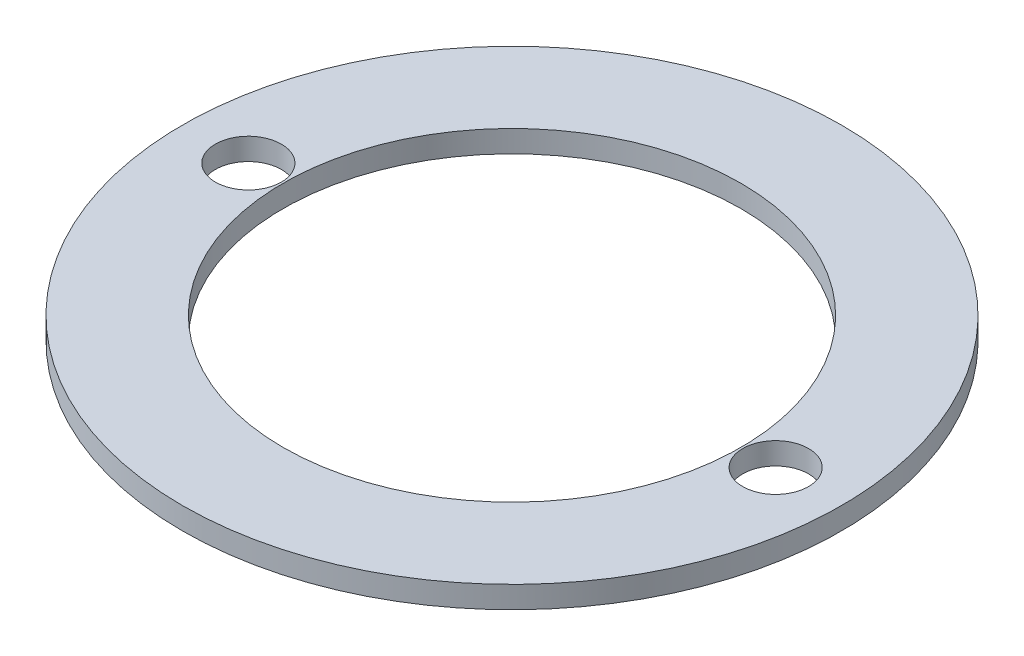
ISO-10303-21;
HEADER;
FILE_DESCRIPTION(('STEP AP214'),'2;1');
FILE_NAME('part.step','',(''),(''),'','','');
FILE_SCHEMA(('AUTOMOTIVE_DESIGN { 1 0 10303 214 1 1 1 1 }'));
ENDSEC;
DATA;
#1=APPLICATION_CONTEXT('core data for automotive mechanical design processes');
#2=APPLICATION_PROTOCOL_DEFINITION('international standard','automotive_design',2000,#1);
#3=PRODUCT_CONTEXT('',#1,'mechanical');
#4=PRODUCT('Part','Part','',(#3));
#5=PRODUCT_RELATED_PRODUCT_CATEGORY('part','',(#4));
#6=PRODUCT_DEFINITION_FORMATION('','',#4);
#7=PRODUCT_DEFINITION_CONTEXT('part definition',#1,'design');
#8=PRODUCT_DEFINITION('design','',#6,#7);
#9=PRODUCT_DEFINITION_SHAPE('','',#8);
#10=(LENGTH_UNIT() NAMED_UNIT(*) SI_UNIT(.MILLI.,.METRE.));
#11=(NAMED_UNIT(*) PLANE_ANGLE_UNIT() SI_UNIT($,.RADIAN.));
#12=(NAMED_UNIT(*) SI_UNIT($,.STERADIAN.) SOLID_ANGLE_UNIT());
#13=UNCERTAINTY_MEASURE_WITH_UNIT(LENGTH_MEASURE(1.E-05),#10,'distance_accuracy_value','');
#14=(GEOMETRIC_REPRESENTATION_CONTEXT(3) GLOBAL_UNCERTAINTY_ASSIGNED_CONTEXT((#13)) GLOBAL_UNIT_ASSIGNED_CONTEXT((#10,
#11,#12)) REPRESENTATION_CONTEXT('',''));
#15=CARTESIAN_POINT('',(0.,0.,0.));
#16=DIRECTION('',(0.,0.,1.));
#17=DIRECTION('',(1.,0.,0.));
#18=AXIS2_PLACEMENT_3D('',#15,#16,#17);
#19=CARTESIAN_POINT('',(0.,1.524,0.));
#20=DIRECTION('',(0.,1.,0.));
#21=DIRECTION('',(0.,0.,1.));
#22=AXIS2_PLACEMENT_3D('',#19,#20,#21);
#23=PLANE('',#22);
#24=CARTESIAN_POINT('',(-18.288,1.524,0.));
#25=DIRECTION('',(0.,1.,0.));
#26=DIRECTION('',(0.,0.,1.));
#27=AXIS2_PLACEMENT_3D('',#24,#25,#26);
#28=CIRCLE('',#27,2.286);
#29=CARTESIAN_POINT('',(-18.288,1.524,-2.286));
#30=VERTEX_POINT('',#29);
#31=EDGE_CURVE('E51',#30,#30,#28,.T.);
#32=ORIENTED_EDGE('',*,*,#31,.F.);
#33=EDGE_LOOP('',(#32));
#34=FACE_BOUND('',#33,.T.);
#35=CARTESIAN_POINT('',(0.,1.524,0.));
#36=DIRECTION('',(0.,1.,0.));
#37=DIRECTION('',(0.,0.,1.));
#38=AXIS2_PLACEMENT_3D('',#35,#36,#37);
#39=CIRCLE('',#38,22.86);
#40=CARTESIAN_POINT('',(0.,1.524,-22.86));
#41=VERTEX_POINT('',#40);
#42=EDGE_CURVE('E10',#41,#41,#39,.T.);
#43=ORIENTED_EDGE('',*,*,#42,.T.);
#44=EDGE_LOOP('',(#43));
#45=FACE_BOUND('',#44,.T.);
#46=CARTESIAN_POINT('',(0.,1.524,0.));
#47=DIRECTION('',(0.,1.,0.));
#48=DIRECTION('',(0.,0.,1.));
#49=AXIS2_PLACEMENT_3D('',#46,#47,#48);
#50=CIRCLE('',#49,15.875);
#51=CARTESIAN_POINT('',(0.,1.524,-15.875));
#52=VERTEX_POINT('',#51);
#53=EDGE_CURVE('E46',#52,#52,#50,.T.);
#54=ORIENTED_EDGE('',*,*,#53,.F.);
#55=EDGE_LOOP('',(#54));
#56=FACE_BOUND('',#55,.T.);
#57=CARTESIAN_POINT('',(18.288,1.524,0.));
#58=DIRECTION('',(0.,1.,0.));
#59=DIRECTION('',(0.,0.,1.));
#60=AXIS2_PLACEMENT_3D('',#57,#58,#59);
#61=CIRCLE('',#60,2.286);
#62=CARTESIAN_POINT('',(18.288,1.524,-2.286));
#63=VERTEX_POINT('',#62);
#64=EDGE_CURVE('E57',#63,#63,#61,.T.);
#65=ORIENTED_EDGE('',*,*,#64,.F.);
#66=EDGE_LOOP('',(#65));
#67=FACE_BOUND('',#66,.T.);
#68=ADVANCED_FACE('F35',(#34,#45,#56,#67),#23,.T.);
#69=CARTESIAN_POINT('',(0.,0.,0.));
#70=DIRECTION('',(0.,1.,0.));
#71=DIRECTION('',(0.,0.,1.));
#72=AXIS2_PLACEMENT_3D('',#69,#70,#71);
#73=PLANE('',#72);
#74=CARTESIAN_POINT('',(0.,0.,0.));
#75=DIRECTION('',(0.,1.,0.));
#76=DIRECTION('',(0.,0.,1.));
#77=AXIS2_PLACEMENT_3D('',#74,#75,#76);
#78=CIRCLE('',#77,22.86);
#79=CARTESIAN_POINT('',(0.,0.,-22.86));
#80=VERTEX_POINT('',#79);
#81=EDGE_CURVE('E39',#80,#80,#78,.T.);
#82=ORIENTED_EDGE('',*,*,#81,.F.);
#83=EDGE_LOOP('',(#82));
#84=FACE_BOUND('',#83,.T.);
#85=CARTESIAN_POINT('',(0.,0.,0.));
#86=DIRECTION('',(0.,1.,0.));
#87=DIRECTION('',(0.,0.,1.));
#88=AXIS2_PLACEMENT_3D('',#85,#86,#87);
#89=CIRCLE('',#88,15.875);
#90=CARTESIAN_POINT('',(0.,0.,-15.875));
#91=VERTEX_POINT('',#90);
#92=EDGE_CURVE('E48',#91,#91,#89,.T.);
#93=ORIENTED_EDGE('',*,*,#92,.T.);
#94=EDGE_LOOP('',(#93));
#95=FACE_BOUND('',#94,.T.);
#96=CARTESIAN_POINT('',(-18.288,0.,0.));
#97=DIRECTION('',(0.,1.,0.));
#98=DIRECTION('',(0.,0.,1.));
#99=AXIS2_PLACEMENT_3D('',#96,#97,#98);
#100=CIRCLE('',#99,2.286);
#101=CARTESIAN_POINT('',(-18.288,0.,-2.286));
#102=VERTEX_POINT('',#101);
#103=EDGE_CURVE('E54',#102,#102,#100,.T.);
#104=ORIENTED_EDGE('',*,*,#103,.T.);
#105=EDGE_LOOP('',(#104));
#106=FACE_BOUND('',#105,.T.);
#107=CARTESIAN_POINT('',(18.288,0.,0.));
#108=DIRECTION('',(0.,1.,0.));
#109=DIRECTION('',(0.,0.,1.));
#110=AXIS2_PLACEMENT_3D('',#107,#108,#109);
#111=CIRCLE('',#110,2.286);
#112=CARTESIAN_POINT('',(18.288,0.,-2.286));
#113=VERTEX_POINT('',#112);
#114=EDGE_CURVE('E60',#113,#113,#111,.T.);
#115=ORIENTED_EDGE('',*,*,#114,.T.);
#116=EDGE_LOOP('',(#115));
#117=FACE_BOUND('',#116,.T.);
#118=ADVANCED_FACE('F70',(#84,#95,#106,#117),#73,.F.);
#119=CARTESIAN_POINT('',(0.,1.524,0.));
#120=DIRECTION('',(0.,-1.,0.));
#121=DIRECTION('',(0.,0.,-1.));
#122=AXIS2_PLACEMENT_3D('',#119,#120,#121);
#123=CYLINDRICAL_SURFACE('',#122,22.86);
#124=CARTESIAN_POINT('',(0.,1.524,-22.86));
#125=CARTESIAN_POINT('',(0.,1.508125,-22.86));
#126=CARTESIAN_POINT('',(0.,1.49225,-22.86));
#127=CARTESIAN_POINT('',(0.,1.4605,-22.86));
#128=CARTESIAN_POINT('',(0.,1.444625,-22.86));
#129=CARTESIAN_POINT('',(0.,1.412875,-22.86));
#130=CARTESIAN_POINT('',(0.,1.397,-22.86));
#131=CARTESIAN_POINT('',(0.,1.36525,-22.86));
#132=CARTESIAN_POINT('',(0.,1.349375,-22.86));
#133=CARTESIAN_POINT('',(0.,1.317625,-22.86));
#134=CARTESIAN_POINT('',(0.,1.30175,-22.86));
#135=CARTESIAN_POINT('',(0.,1.27,-22.86));
#136=CARTESIAN_POINT('',(0.,1.254125,-22.86));
#137=CARTESIAN_POINT('',(0.,1.222375,-22.86));
#138=CARTESIAN_POINT('',(0.,1.2065,-22.86));
#139=CARTESIAN_POINT('',(0.,1.17475,-22.86));
#140=CARTESIAN_POINT('',(0.,1.158875,-22.86));
#141=CARTESIAN_POINT('',(0.,1.127125,-22.86));
#142=CARTESIAN_POINT('',(0.,1.11125,-22.86));
#143=CARTESIAN_POINT('',(0.,1.0795,-22.86));
#144=CARTESIAN_POINT('',(0.,1.063625,-22.86));
#145=CARTESIAN_POINT('',(0.,1.031875,-22.86));
#146=CARTESIAN_POINT('',(0.,1.016,-22.86));
#147=CARTESIAN_POINT('',(0.,0.98425,-22.86));
#148=CARTESIAN_POINT('',(0.,0.968375,-22.86));
#149=CARTESIAN_POINT('',(0.,0.936625,-22.86));
#150=CARTESIAN_POINT('',(0.,0.92075,-22.86));
#151=CARTESIAN_POINT('',(0.,0.889,-22.86));
#152=CARTESIAN_POINT('',(0.,0.873125,-22.86));
#153=CARTESIAN_POINT('',(0.,0.841375,-22.86));
#154=CARTESIAN_POINT('',(0.,0.8255,-22.86));
#155=CARTESIAN_POINT('',(0.,0.79375,-22.86));
#156=CARTESIAN_POINT('',(0.,0.777875,-22.86));
#157=CARTESIAN_POINT('',(0.,0.746125,-22.86));
#158=CARTESIAN_POINT('',(0.,0.73025,-22.86));
#159=CARTESIAN_POINT('',(0.,0.6985,-22.86));
#160=CARTESIAN_POINT('',(0.,0.682625,-22.86));
#161=CARTESIAN_POINT('',(0.,0.650875,-22.86));
#162=CARTESIAN_POINT('',(0.,0.635,-22.86));
#163=CARTESIAN_POINT('',(0.,0.60325,-22.86));
#164=CARTESIAN_POINT('',(0.,0.587375,-22.86));
#165=CARTESIAN_POINT('',(0.,0.555625,-22.86));
#166=CARTESIAN_POINT('',(0.,0.53975,-22.86));
#167=CARTESIAN_POINT('',(0.,0.508,-22.86));
#168=CARTESIAN_POINT('',(0.,0.492125,-22.86));
#169=CARTESIAN_POINT('',(0.,0.460375,-22.86));
#170=CARTESIAN_POINT('',(0.,0.4445,-22.86));
#171=CARTESIAN_POINT('',(0.,0.41275,-22.86));
#172=CARTESIAN_POINT('',(0.,0.396875,-22.86));
#173=CARTESIAN_POINT('',(0.,0.365125,-22.86));
#174=CARTESIAN_POINT('',(0.,0.34925,-22.86));
#175=CARTESIAN_POINT('',(0.,0.3175,-22.86));
#176=CARTESIAN_POINT('',(0.,0.301625,-22.86));
#177=CARTESIAN_POINT('',(0.,0.269875,-22.86));
#178=CARTESIAN_POINT('',(0.,0.254,-22.86));
#179=CARTESIAN_POINT('',(0.,0.22225,-22.86));
#180=CARTESIAN_POINT('',(0.,0.206375,-22.86));
#181=CARTESIAN_POINT('',(0.,0.174625,-22.86));
#182=CARTESIAN_POINT('',(0.,0.15875,-22.86));
#183=CARTESIAN_POINT('',(0.,0.127,-22.86));
#184=CARTESIAN_POINT('',(0.,0.111125,-22.86));
#185=CARTESIAN_POINT('',(0.,0.079375,-22.86));
#186=CARTESIAN_POINT('',(0.,0.0635,-22.86));
#187=CARTESIAN_POINT('',(0.,0.0317499999999999,-22.86));
#188=CARTESIAN_POINT('',(0.,0.015875,-22.86));
#189=CARTESIAN_POINT('',(0.,0.,-22.86));
#190=B_SPLINE_CURVE_WITH_KNOTS('',3,(#124,#125,#126,#127,#128,#129,#130,#131,#132,#133,#134,
#135,#136,#137,#138,#139,#140,#141,#142,#143,#144,#145,#146,#147,#148,#149,#150,#151,#152,#153,
#154,#155,#156,#157,#158,#159,#160,#161,#162,#163,#164,#165,#166,#167,#168,#169,#170,#171,#172,
#173,#174,#175,#176,#177,#178,#179,#180,#181,#182,#183,#184,#185,#186,#187,#188,#189),
.UNSPECIFIED.,.F.,.F.,(4,2,2,2,2,2,2,2,2,2,2,2,2,2,2,2,2,2,2,2,2,2,2,2,2,2,2,2,2,2,2,2,4),(0.,
0.0476250000000001,0.0952500000000001,0.142875,0.1905,0.238125,0.28575,0.333375,0.381,0.428625,
0.47625,0.523875,0.5715,0.619125,0.66675,0.714375,0.762,0.809625,0.85725,0.904875,0.9525,
1.000125,1.04775,1.095375,1.143,1.190625,1.23825,1.285875,1.3335,1.381125,1.42875,1.476375,
1.524),.UNSPECIFIED.);
#191=EDGE_CURVE('BSEAM37',#41,#80,#190,.T.);
#192=ORIENTED_EDGE('',*,*,#42,.F.);
#193=ORIENTED_EDGE('',*,*,#81,.T.);
#194=ORIENTED_EDGE('',*,*,#191,.T.);
#195=ORIENTED_EDGE('',*,*,#191,.F.);
#196=EDGE_LOOP('',(#192,#194,#193,#195));
#197=FACE_BOUND('',#196,.T.);
#198=ADVANCED_FACE('F37',(#197),#123,.T.);
#199=CARTESIAN_POINT('',(0.,1.524,0.));
#200=DIRECTION('',(0.,-1.,0.));
#201=DIRECTION('',(0.,0.,-1.));
#202=AXIS2_PLACEMENT_3D('',#199,#200,#201);
#203=CYLINDRICAL_SURFACE('',#202,15.875);
#204=CARTESIAN_POINT('',(0.,1.524,-15.875));
#205=CARTESIAN_POINT('',(0.,1.508125,-15.875));
#206=CARTESIAN_POINT('',(0.,1.49225,-15.875));
#207=CARTESIAN_POINT('',(0.,1.4605,-15.875));
#208=CARTESIAN_POINT('',(0.,1.444625,-15.875));
#209=CARTESIAN_POINT('',(0.,1.412875,-15.875));
#210=CARTESIAN_POINT('',(0.,1.397,-15.875));
#211=CARTESIAN_POINT('',(0.,1.36525,-15.875));
#212=CARTESIAN_POINT('',(0.,1.349375,-15.875));
#213=CARTESIAN_POINT('',(0.,1.317625,-15.875));
#214=CARTESIAN_POINT('',(0.,1.30175,-15.875));
#215=CARTESIAN_POINT('',(0.,1.27,-15.875));
#216=CARTESIAN_POINT('',(0.,1.254125,-15.875));
#217=CARTESIAN_POINT('',(0.,1.222375,-15.875));
#218=CARTESIAN_POINT('',(0.,1.2065,-15.875));
#219=CARTESIAN_POINT('',(0.,1.17475,-15.875));
#220=CARTESIAN_POINT('',(0.,1.158875,-15.875));
#221=CARTESIAN_POINT('',(0.,1.127125,-15.875));
#222=CARTESIAN_POINT('',(0.,1.11125,-15.875));
#223=CARTESIAN_POINT('',(0.,1.0795,-15.875));
#224=CARTESIAN_POINT('',(0.,1.063625,-15.875));
#225=CARTESIAN_POINT('',(0.,1.031875,-15.875));
#226=CARTESIAN_POINT('',(0.,1.016,-15.875));
#227=CARTESIAN_POINT('',(0.,0.98425,-15.875));
#228=CARTESIAN_POINT('',(0.,0.968375,-15.875));
#229=CARTESIAN_POINT('',(0.,0.936625,-15.875));
#230=CARTESIAN_POINT('',(0.,0.92075,-15.875));
#231=CARTESIAN_POINT('',(0.,0.889,-15.875));
#232=CARTESIAN_POINT('',(0.,0.873125,-15.875));
#233=CARTESIAN_POINT('',(0.,0.841375,-15.875));
#234=CARTESIAN_POINT('',(0.,0.8255,-15.875));
#235=CARTESIAN_POINT('',(0.,0.79375,-15.875));
#236=CARTESIAN_POINT('',(0.,0.777875,-15.875));
#237=CARTESIAN_POINT('',(0.,0.746125,-15.875));
#238=CARTESIAN_POINT('',(0.,0.73025,-15.875));
#239=CARTESIAN_POINT('',(0.,0.6985,-15.875));
#240=CARTESIAN_POINT('',(0.,0.682625,-15.875));
#241=CARTESIAN_POINT('',(0.,0.650875,-15.875));
#242=CARTESIAN_POINT('',(0.,0.635,-15.875));
#243=CARTESIAN_POINT('',(0.,0.60325,-15.875));
#244=CARTESIAN_POINT('',(0.,0.587375,-15.875));
#245=CARTESIAN_POINT('',(0.,0.555625,-15.875));
#246=CARTESIAN_POINT('',(0.,0.53975,-15.875));
#247=CARTESIAN_POINT('',(0.,0.508,-15.875));
#248=CARTESIAN_POINT('',(0.,0.492125,-15.875));
#249=CARTESIAN_POINT('',(0.,0.460375,-15.875));
#250=CARTESIAN_POINT('',(0.,0.4445,-15.875));
#251=CARTESIAN_POINT('',(0.,0.41275,-15.875));
#252=CARTESIAN_POINT('',(0.,0.396875,-15.875));
#253=CARTESIAN_POINT('',(0.,0.365125,-15.875));
#254=CARTESIAN_POINT('',(0.,0.34925,-15.875));
#255=CARTESIAN_POINT('',(0.,0.3175,-15.875));
#256=CARTESIAN_POINT('',(0.,0.301625,-15.875));
#257=CARTESIAN_POINT('',(0.,0.269875,-15.875));
#258=CARTESIAN_POINT('',(0.,0.254,-15.875));
#259=CARTESIAN_POINT('',(0.,0.22225,-15.875));
#260=CARTESIAN_POINT('',(0.,0.206375,-15.875));
#261=CARTESIAN_POINT('',(0.,0.174625,-15.875));
#262=CARTESIAN_POINT('',(0.,0.15875,-15.875));
#263=CARTESIAN_POINT('',(0.,0.127,-15.875));
#264=CARTESIAN_POINT('',(0.,0.111125,-15.875));
#265=CARTESIAN_POINT('',(0.,0.079375,-15.875));
#266=CARTESIAN_POINT('',(0.,0.0635,-15.875));
#267=CARTESIAN_POINT('',(0.,0.0317499999999999,-15.875));
#268=CARTESIAN_POINT('',(0.,0.015875,-15.875));
#269=CARTESIAN_POINT('',(0.,0.,-15.875));
#270=B_SPLINE_CURVE_WITH_KNOTS('',3,(#204,#205,#206,#207,#208,#209,#210,#211,#212,#213,#214,
#215,#216,#217,#218,#219,#220,#221,#222,#223,#224,#225,#226,#227,#228,#229,#230,#231,#232,#233,
#234,#235,#236,#237,#238,#239,#240,#241,#242,#243,#244,#245,#246,#247,#248,#249,#250,#251,#252,
#253,#254,#255,#256,#257,#258,#259,#260,#261,#262,#263,#264,#265,#266,#267,#268,#269),
.UNSPECIFIED.,.F.,.F.,(4,2,2,2,2,2,2,2,2,2,2,2,2,2,2,2,2,2,2,2,2,2,2,2,2,2,2,2,2,2,2,2,4),(0.,
0.0476249999999999,0.0952499999999998,0.142875,0.1905,0.238125,0.28575,0.333375,0.381,0.428625,
0.47625,0.523875,0.5715,0.619125,0.66675,0.714375,0.762,0.809625,0.85725,0.904875,0.9525,
1.000125,1.04775,1.095375,1.143,1.190625,1.23825,1.285875,1.3335,1.381125,1.42875,1.476375,
1.524),.UNSPECIFIED.);
#271=EDGE_CURVE('BSEAM79',#52,#91,#270,.T.);
#272=ORIENTED_EDGE('',*,*,#53,.T.);
#273=ORIENTED_EDGE('',*,*,#92,.F.);
#274=ORIENTED_EDGE('',*,*,#271,.T.);
#275=ORIENTED_EDGE('',*,*,#271,.F.);
#276=EDGE_LOOP('',(#272,#274,#273,#275));
#277=FACE_BOUND('',#276,.T.);
#278=ADVANCED_FACE('F79',(#277),#203,.F.);
#279=CARTESIAN_POINT('',(-18.288,1.524,0.));
#280=DIRECTION('',(0.,-1.,0.));
#281=DIRECTION('',(0.,0.,-1.));
#282=AXIS2_PLACEMENT_3D('',#279,#280,#281);
#283=CYLINDRICAL_SURFACE('',#282,2.286);
#284=CARTESIAN_POINT('',(-18.288,1.524,-2.286));
#285=CARTESIAN_POINT('',(-18.288,1.508125,-2.286));
#286=CARTESIAN_POINT('',(-18.288,1.49225,-2.286));
#287=CARTESIAN_POINT('',(-18.288,1.4605,-2.286));
#288=CARTESIAN_POINT('',(-18.288,1.444625,-2.286));
#289=CARTESIAN_POINT('',(-18.288,1.412875,-2.286));
#290=CARTESIAN_POINT('',(-18.288,1.397,-2.286));
#291=CARTESIAN_POINT('',(-18.288,1.36525,-2.286));
#292=CARTESIAN_POINT('',(-18.288,1.349375,-2.286));
#293=CARTESIAN_POINT('',(-18.288,1.317625,-2.286));
#294=CARTESIAN_POINT('',(-18.288,1.30175,-2.286));
#295=CARTESIAN_POINT('',(-18.288,1.27,-2.286));
#296=CARTESIAN_POINT('',(-18.288,1.254125,-2.286));
#297=CARTESIAN_POINT('',(-18.288,1.222375,-2.286));
#298=CARTESIAN_POINT('',(-18.288,1.2065,-2.286));
#299=CARTESIAN_POINT('',(-18.288,1.17475,-2.286));
#300=CARTESIAN_POINT('',(-18.288,1.158875,-2.286));
#301=CARTESIAN_POINT('',(-18.288,1.127125,-2.286));
#302=CARTESIAN_POINT('',(-18.288,1.11125,-2.286));
#303=CARTESIAN_POINT('',(-18.288,1.0795,-2.286));
#304=CARTESIAN_POINT('',(-18.288,1.063625,-2.286));
#305=CARTESIAN_POINT('',(-18.288,1.031875,-2.286));
#306=CARTESIAN_POINT('',(-18.288,1.016,-2.286));
#307=CARTESIAN_POINT('',(-18.288,0.98425,-2.286));
#308=CARTESIAN_POINT('',(-18.288,0.968375,-2.286));
#309=CARTESIAN_POINT('',(-18.288,0.936625,-2.286));
#310=CARTESIAN_POINT('',(-18.288,0.92075,-2.286));
#311=CARTESIAN_POINT('',(-18.288,0.889,-2.286));
#312=CARTESIAN_POINT('',(-18.288,0.873125,-2.286));
#313=CARTESIAN_POINT('',(-18.288,0.841375,-2.286));
#314=CARTESIAN_POINT('',(-18.288,0.8255,-2.286));
#315=CARTESIAN_POINT('',(-18.288,0.79375,-2.286));
#316=CARTESIAN_POINT('',(-18.288,0.777875,-2.286));
#317=CARTESIAN_POINT('',(-18.288,0.746125,-2.286));
#318=CARTESIAN_POINT('',(-18.288,0.73025,-2.286));
#319=CARTESIAN_POINT('',(-18.288,0.6985,-2.286));
#320=CARTESIAN_POINT('',(-18.288,0.682625,-2.286));
#321=CARTESIAN_POINT('',(-18.288,0.650875,-2.286));
#322=CARTESIAN_POINT('',(-18.288,0.635,-2.286));
#323=CARTESIAN_POINT('',(-18.288,0.60325,-2.286));
#324=CARTESIAN_POINT('',(-18.288,0.587375,-2.286));
#325=CARTESIAN_POINT('',(-18.288,0.555625,-2.286));
#326=CARTESIAN_POINT('',(-18.288,0.53975,-2.286));
#327=CARTESIAN_POINT('',(-18.288,0.508,-2.286));
#328=CARTESIAN_POINT('',(-18.288,0.492125,-2.286));
#329=CARTESIAN_POINT('',(-18.288,0.460375,-2.286));
#330=CARTESIAN_POINT('',(-18.288,0.4445,-2.286));
#331=CARTESIAN_POINT('',(-18.288,0.41275,-2.286));
#332=CARTESIAN_POINT('',(-18.288,0.396875,-2.286));
#333=CARTESIAN_POINT('',(-18.288,0.365125,-2.286));
#334=CARTESIAN_POINT('',(-18.288,0.34925,-2.286));
#335=CARTESIAN_POINT('',(-18.288,0.3175,-2.286));
#336=CARTESIAN_POINT('',(-18.288,0.301625,-2.286));
#337=CARTESIAN_POINT('',(-18.288,0.269875,-2.286));
#338=CARTESIAN_POINT('',(-18.288,0.254,-2.286));
#339=CARTESIAN_POINT('',(-18.288,0.22225,-2.286));
#340=CARTESIAN_POINT('',(-18.288,0.206375,-2.286));
#341=CARTESIAN_POINT('',(-18.288,0.174625,-2.286));
#342=CARTESIAN_POINT('',(-18.288,0.15875,-2.286));
#343=CARTESIAN_POINT('',(-18.288,0.127,-2.286));
#344=CARTESIAN_POINT('',(-18.288,0.111125,-2.286));
#345=CARTESIAN_POINT('',(-18.288,0.079375,-2.286));
#346=CARTESIAN_POINT('',(-18.288,0.0635,-2.286));
#347=CARTESIAN_POINT('',(-18.288,0.0317499999999999,-2.286));
#348=CARTESIAN_POINT('',(-18.288,0.015875,-2.286));
#349=CARTESIAN_POINT('',(-18.288,0.,-2.286));
#350=B_SPLINE_CURVE_WITH_KNOTS('',3,(#284,#285,#286,#287,#288,#289,#290,#291,#292,#293,#294,
#295,#296,#297,#298,#299,#300,#301,#302,#303,#304,#305,#306,#307,#308,#309,#310,#311,#312,#313,
#314,#315,#316,#317,#318,#319,#320,#321,#322,#323,#324,#325,#326,#327,#328,#329,#330,#331,#332,
#333,#334,#335,#336,#337,#338,#339,#340,#341,#342,#343,#344,#345,#346,#347,#348,#349),
.UNSPECIFIED.,.F.,.F.,(4,2,2,2,2,2,2,2,2,2,2,2,2,2,2,2,2,2,2,2,2,2,2,2,2,2,2,2,2,2,2,2,4),(0.,
0.0476249999999999,0.0952499999999998,0.142875,0.1905,0.238125,0.28575,0.333375,0.381,0.428625,
0.47625,0.523875,0.5715,0.619125,0.66675,0.714375,0.762,0.809625,0.85725,0.904875,0.9525,
1.000125,1.04775,1.095375,1.143,1.190625,1.23825,1.285875,1.3335,1.381125,1.42875,1.476375,
1.524),.UNSPECIFIED.);
#351=EDGE_CURVE('BSEAM82',#30,#102,#350,.T.);
#352=ORIENTED_EDGE('',*,*,#31,.T.);
#353=ORIENTED_EDGE('',*,*,#103,.F.);
#354=ORIENTED_EDGE('',*,*,#351,.T.);
#355=ORIENTED_EDGE('',*,*,#351,.F.);
#356=EDGE_LOOP('',(#352,#354,#353,#355));
#357=FACE_BOUND('',#356,.T.);
#358=ADVANCED_FACE('F82',(#357),#283,.F.);
#359=CARTESIAN_POINT('',(18.288,1.524,0.));
#360=DIRECTION('',(0.,-1.,0.));
#361=DIRECTION('',(0.,0.,-1.));
#362=AXIS2_PLACEMENT_3D('',#359,#360,#361);
#363=CYLINDRICAL_SURFACE('',#362,2.286);
#364=CARTESIAN_POINT('',(18.288,1.524,-2.286));
#365=CARTESIAN_POINT('',(18.288,1.508125,-2.286));
#366=CARTESIAN_POINT('',(18.288,1.49225,-2.286));
#367=CARTESIAN_POINT('',(18.288,1.4605,-2.286));
#368=CARTESIAN_POINT('',(18.288,1.444625,-2.286));
#369=CARTESIAN_POINT('',(18.288,1.412875,-2.286));
#370=CARTESIAN_POINT('',(18.288,1.397,-2.286));
#371=CARTESIAN_POINT('',(18.288,1.36525,-2.286));
#372=CARTESIAN_POINT('',(18.288,1.349375,-2.286));
#373=CARTESIAN_POINT('',(18.288,1.317625,-2.286));
#374=CARTESIAN_POINT('',(18.288,1.30175,-2.286));
#375=CARTESIAN_POINT('',(18.288,1.27,-2.286));
#376=CARTESIAN_POINT('',(18.288,1.254125,-2.286));
#377=CARTESIAN_POINT('',(18.288,1.222375,-2.286));
#378=CARTESIAN_POINT('',(18.288,1.2065,-2.286));
#379=CARTESIAN_POINT('',(18.288,1.17475,-2.286));
#380=CARTESIAN_POINT('',(18.288,1.158875,-2.286));
#381=CARTESIAN_POINT('',(18.288,1.127125,-2.286));
#382=CARTESIAN_POINT('',(18.288,1.11125,-2.286));
#383=CARTESIAN_POINT('',(18.288,1.0795,-2.286));
#384=CARTESIAN_POINT('',(18.288,1.063625,-2.286));
#385=CARTESIAN_POINT('',(18.288,1.031875,-2.286));
#386=CARTESIAN_POINT('',(18.288,1.016,-2.286));
#387=CARTESIAN_POINT('',(18.288,0.98425,-2.286));
#388=CARTESIAN_POINT('',(18.288,0.968375,-2.286));
#389=CARTESIAN_POINT('',(18.288,0.936625,-2.286));
#390=CARTESIAN_POINT('',(18.288,0.92075,-2.286));
#391=CARTESIAN_POINT('',(18.288,0.889,-2.286));
#392=CARTESIAN_POINT('',(18.288,0.873125,-2.286));
#393=CARTESIAN_POINT('',(18.288,0.841375,-2.286));
#394=CARTESIAN_POINT('',(18.288,0.8255,-2.286));
#395=CARTESIAN_POINT('',(18.288,0.79375,-2.286));
#396=CARTESIAN_POINT('',(18.288,0.777875,-2.286));
#397=CARTESIAN_POINT('',(18.288,0.746125,-2.286));
#398=CARTESIAN_POINT('',(18.288,0.73025,-2.286));
#399=CARTESIAN_POINT('',(18.288,0.6985,-2.286));
#400=CARTESIAN_POINT('',(18.288,0.682625,-2.286));
#401=CARTESIAN_POINT('',(18.288,0.650875,-2.286));
#402=CARTESIAN_POINT('',(18.288,0.635,-2.286));
#403=CARTESIAN_POINT('',(18.288,0.60325,-2.286));
#404=CARTESIAN_POINT('',(18.288,0.587375,-2.286));
#405=CARTESIAN_POINT('',(18.288,0.555625,-2.286));
#406=CARTESIAN_POINT('',(18.288,0.53975,-2.286));
#407=CARTESIAN_POINT('',(18.288,0.508,-2.286));
#408=CARTESIAN_POINT('',(18.288,0.492125,-2.286));
#409=CARTESIAN_POINT('',(18.288,0.460375,-2.286));
#410=CARTESIAN_POINT('',(18.288,0.4445,-2.286));
#411=CARTESIAN_POINT('',(18.288,0.41275,-2.286));
#412=CARTESIAN_POINT('',(18.288,0.396875,-2.286));
#413=CARTESIAN_POINT('',(18.288,0.365125,-2.286));
#414=CARTESIAN_POINT('',(18.288,0.34925,-2.286));
#415=CARTESIAN_POINT('',(18.288,0.3175,-2.286));
#416=CARTESIAN_POINT('',(18.288,0.301625,-2.286));
#417=CARTESIAN_POINT('',(18.288,0.269875,-2.286));
#418=CARTESIAN_POINT('',(18.288,0.254,-2.286));
#419=CARTESIAN_POINT('',(18.288,0.22225,-2.286));
#420=CARTESIAN_POINT('',(18.288,0.206375,-2.286));
#421=CARTESIAN_POINT('',(18.288,0.174625,-2.286));
#422=CARTESIAN_POINT('',(18.288,0.15875,-2.286));
#423=CARTESIAN_POINT('',(18.288,0.127,-2.286));
#424=CARTESIAN_POINT('',(18.288,0.111125,-2.286));
#425=CARTESIAN_POINT('',(18.288,0.079375,-2.286));
#426=CARTESIAN_POINT('',(18.288,0.0635,-2.286));
#427=CARTESIAN_POINT('',(18.288,0.0317499999999999,-2.286));
#428=CARTESIAN_POINT('',(18.288,0.015875,-2.286));
#429=CARTESIAN_POINT('',(18.288,0.,-2.286));
#430=B_SPLINE_CURVE_WITH_KNOTS('',3,(#364,#365,#366,#367,#368,#369,#370,#371,#372,#373,#374,
#375,#376,#377,#378,#379,#380,#381,#382,#383,#384,#385,#386,#387,#388,#389,#390,#391,#392,#393,
#394,#395,#396,#397,#398,#399,#400,#401,#402,#403,#404,#405,#406,#407,#408,#409,#410,#411,#412,
#413,#414,#415,#416,#417,#418,#419,#420,#421,#422,#423,#424,#425,#426,#427,#428,#429),
.UNSPECIFIED.,.F.,.F.,(4,2,2,2,2,2,2,2,2,2,2,2,2,2,2,2,2,2,2,2,2,2,2,2,2,2,2,2,2,2,2,2,4),(0.,
0.0476249999999999,0.0952499999999998,0.142875,0.1905,0.238125,0.28575,0.333375,0.381,0.428625,
0.47625,0.523875,0.5715,0.619125,0.66675,0.714375,0.762,0.809625,0.85725,0.904875,0.9525,
1.000125,1.04775,1.095375,1.143,1.190625,1.23825,1.285875,1.3335,1.381125,1.42875,1.476375,
1.524),.UNSPECIFIED.);
#431=EDGE_CURVE('BSEAM66',#63,#113,#430,.T.);
#432=ORIENTED_EDGE('',*,*,#64,.T.);
#433=ORIENTED_EDGE('',*,*,#114,.F.);
#434=ORIENTED_EDGE('',*,*,#431,.T.);
#435=ORIENTED_EDGE('',*,*,#431,.F.);
#436=EDGE_LOOP('',(#432,#434,#433,#435));
#437=FACE_BOUND('',#436,.T.);
#438=ADVANCED_FACE('F66',(#437),#363,.F.);
#439=CLOSED_SHELL('',(#68,#118,#198,#278,#358,#438));
#440=MANIFOLD_SOLID_BREP('B2',#439);
#441=ADVANCED_BREP_SHAPE_REPRESENTATION('',(#18,#440),#14);
#442=SHAPE_DEFINITION_REPRESENTATION(#9,#441);
ENDSEC;
END-ISO-10303-21;
